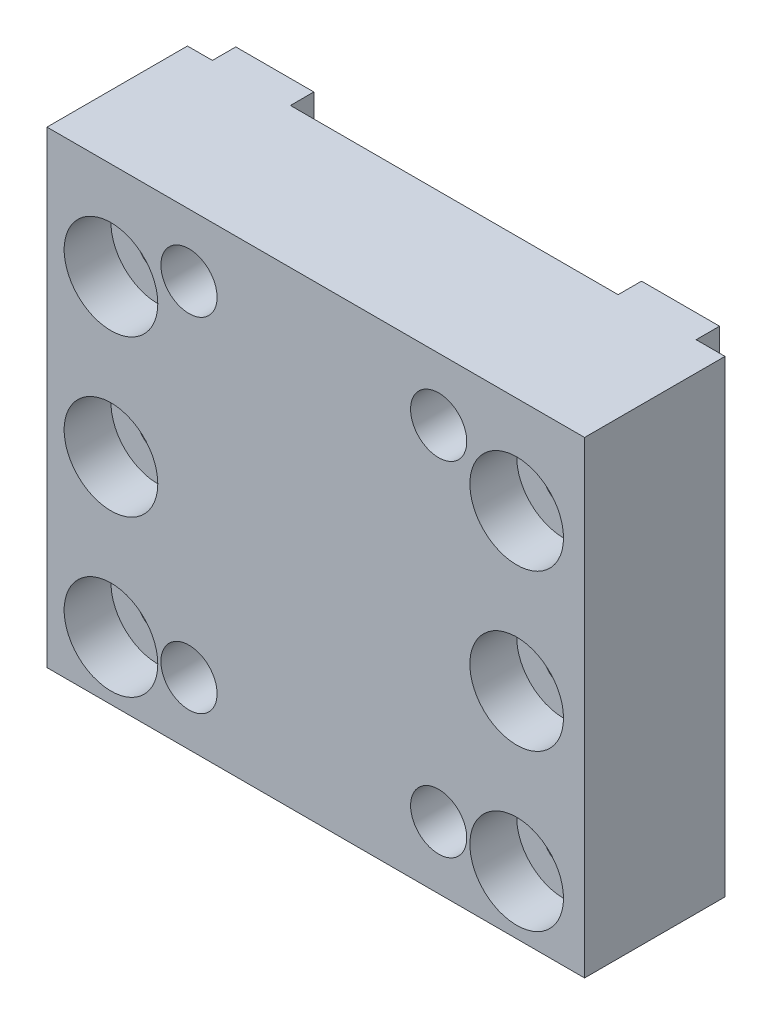
ISO-10303-21;
HEADER;
FILE_DESCRIPTION(('STEP AP214'),'2;1');
FILE_NAME('part.step','',(''),(''),'','','');
FILE_SCHEMA(('AUTOMOTIVE_DESIGN { 1 0 10303 214 1 1 1 1 }'));
ENDSEC;
DATA;
#1=APPLICATION_CONTEXT('core data for automotive mechanical design processes');
#2=APPLICATION_PROTOCOL_DEFINITION('international standard','automotive_design',2000,#1);
#3=PRODUCT_CONTEXT('',#1,'mechanical');
#4=PRODUCT('Part','Part','',(#3));
#5=PRODUCT_RELATED_PRODUCT_CATEGORY('part','',(#4));
#6=PRODUCT_DEFINITION_FORMATION('','',#4);
#7=PRODUCT_DEFINITION_CONTEXT('part definition',#1,'design');
#8=PRODUCT_DEFINITION('design','',#6,#7);
#9=PRODUCT_DEFINITION_SHAPE('','',#8);
#10=(LENGTH_UNIT() NAMED_UNIT(*) SI_UNIT(.MILLI.,.METRE.));
#11=(NAMED_UNIT(*) PLANE_ANGLE_UNIT() SI_UNIT($,.RADIAN.));
#12=(NAMED_UNIT(*) SI_UNIT($,.STERADIAN.) SOLID_ANGLE_UNIT());
#13=UNCERTAINTY_MEASURE_WITH_UNIT(LENGTH_MEASURE(1.E-05),#10,'distance_accuracy_value','');
#14=(GEOMETRIC_REPRESENTATION_CONTEXT(3) GLOBAL_UNCERTAINTY_ASSIGNED_CONTEXT((#13)) GLOBAL_UNIT_ASSIGNED_CONTEXT((#10,
#11,#12)) REPRESENTATION_CONTEXT('',''));
#15=CARTESIAN_POINT('',(0.,0.,0.));
#16=DIRECTION('',(0.,0.,1.));
#17=DIRECTION('',(1.,0.,0.));
#18=AXIS2_PLACEMENT_3D('',#15,#16,#17);
#19=CARTESIAN_POINT('',(0.,0.,9.));
#20=DIRECTION('',(0.,1.,0.));
#21=DIRECTION('',(0.,0.,1.));
#22=AXIS2_PLACEMENT_3D('',#19,#20,#21);
#23=PLANE('',#22);
#24=DIRECTION('',(1.,0.,0.));
#25=VECTOR('',#24,1.);
#26=CARTESIAN_POINT('',(0.,0.,0.));
#27=LINE('',#26,#25);
#28=CARTESIAN_POINT('',(50.6,0.,0.));
#29=VERTEX_POINT('',#28);
#30=CARTESIAN_POINT('',(52.45,0.,0.));
#31=VERTEX_POINT('',#30);
#32=EDGE_CURVE('E164',#29,#31,#27,.T.);
#33=ORIENTED_EDGE('',*,*,#32,.T.);
#34=DIRECTION('',(0.,0.,1.));
#35=VECTOR('',#34,1.);
#36=CARTESIAN_POINT('',(52.45,0.,-1.));
#37=LINE('',#36,#35);
#38=CARTESIAN_POINT('',(52.45,0.,9.));
#39=VERTEX_POINT('',#38);
#40=EDGE_CURVE('E68',#31,#39,#37,.T.);
#41=ORIENTED_EDGE('',*,*,#40,.T.);
#42=DIRECTION('',(1.,0.,0.));
#43=VECTOR('',#42,1.);
#44=CARTESIAN_POINT('',(0.,0.,9.));
#45=LINE('',#44,#43);
#46=CARTESIAN_POINT('',(18.,0.,9.));
#47=VERTEX_POINT('',#46);
#48=EDGE_CURVE('E146',#47,#39,#45,.T.);
#49=ORIENTED_EDGE('',*,*,#48,.F.);
#50=DIRECTION('',(0.,0.,1.));
#51=VECTOR('',#50,1.);
#52=CARTESIAN_POINT('',(18.,0.,-1.));
#53=LINE('',#52,#51);
#54=CARTESIAN_POINT('',(18.,0.,0.));
#55=VERTEX_POINT('',#54);
#56=EDGE_CURVE('E61',#55,#47,#53,.T.);
#57=ORIENTED_EDGE('',*,*,#56,.F.);
#58=CARTESIAN_POINT('',(19.6,0.,0.));
#59=VERTEX_POINT('',#58);
#60=EDGE_CURVE('E160',#55,#59,#27,.T.);
#61=ORIENTED_EDGE('',*,*,#60,.T.);
#62=DIRECTION('',(0.,0.,1.));
#63=VECTOR('',#62,1.);
#64=CARTESIAN_POINT('',(19.6,0.,-2.));
#65=LINE('',#64,#63);
#66=CARTESIAN_POINT('',(19.6,0.,-1.5));
#67=VERTEX_POINT('',#66);
#68=EDGE_CURVE('E207',#67,#59,#65,.T.);
#69=ORIENTED_EDGE('',*,*,#68,.F.);
#70=DIRECTION('',(1.,0.,0.));
#71=VECTOR('',#70,1.);
#72=CARTESIAN_POINT('',(19.6,0.,-1.5));
#73=LINE('',#72,#71);
#74=CARTESIAN_POINT('',(24.6,0.,-1.5));
#75=VERTEX_POINT('',#74);
#76=EDGE_CURVE('E54',#67,#75,#73,.T.);
#77=ORIENTED_EDGE('',*,*,#76,.T.);
#78=DIRECTION('',(0.,0.,1.));
#79=VECTOR('',#78,1.);
#80=CARTESIAN_POINT('',(24.6,0.,-2.));
#81=LINE('',#80,#79);
#82=CARTESIAN_POINT('',(24.6,0.,0.));
#83=VERTEX_POINT('',#82);
#84=EDGE_CURVE('E197',#75,#83,#81,.T.);
#85=ORIENTED_EDGE('',*,*,#84,.T.);
#86=CARTESIAN_POINT('',(45.6,0.,0.));
#87=VERTEX_POINT('',#86);
#88=EDGE_CURVE('E163',#83,#87,#27,.T.);
#89=ORIENTED_EDGE('',*,*,#88,.T.);
#90=DIRECTION('',(0.,0.,1.));
#91=VECTOR('',#90,1.);
#92=CARTESIAN_POINT('',(45.6,0.,-2.));
#93=LINE('',#92,#91);
#94=CARTESIAN_POINT('',(45.6,0.,-1.5));
#95=VERTEX_POINT('',#94);
#96=EDGE_CURVE('E191',#95,#87,#93,.T.);
#97=ORIENTED_EDGE('',*,*,#96,.F.);
#98=DIRECTION('',(1.,0.,0.));
#99=VECTOR('',#98,1.);
#100=CARTESIAN_POINT('',(45.6,0.,-1.5));
#101=LINE('',#100,#99);
#102=CARTESIAN_POINT('',(50.6,0.,-1.5));
#103=VERTEX_POINT('',#102);
#104=EDGE_CURVE('E152',#95,#103,#101,.T.);
#105=ORIENTED_EDGE('',*,*,#104,.T.);
#106=DIRECTION('',(0.,0.,1.));
#107=VECTOR('',#106,1.);
#108=CARTESIAN_POINT('',(50.6,0.,-2.));
#109=LINE('',#108,#107);
#110=EDGE_CURVE('E188',#103,#29,#109,.T.);
#111=ORIENTED_EDGE('',*,*,#110,.T.);
#112=EDGE_LOOP('',(#33,#41,#49,#57,#61,#69,#77,#85,#89,#97,#105,#111));
#113=FACE_BOUND('',#112,.T.);
#114=ADVANCED_FACE('F47',(#113),#23,.F.);
#115=CARTESIAN_POINT('',(0.,30.,9.));
#116=DIRECTION('',(0.,-1.,0.));
#117=DIRECTION('',(0.,0.,-1.));
#118=AXIS2_PLACEMENT_3D('',#115,#116,#117);
#119=PLANE('',#118);
#120=DIRECTION('',(-1.,0.,0.));
#121=VECTOR('',#120,1.);
#122=CARTESIAN_POINT('',(0.,30.,9.));
#123=LINE('',#122,#121);
#124=CARTESIAN_POINT('',(52.45,30.,9.));
#125=VERTEX_POINT('',#124);
#126=CARTESIAN_POINT('',(18.,30.,9.));
#127=VERTEX_POINT('',#126);
#128=EDGE_CURVE('E144',#125,#127,#123,.T.);
#129=ORIENTED_EDGE('',*,*,#128,.F.);
#130=DIRECTION('',(0.,0.,1.));
#131=VECTOR('',#130,1.);
#132=CARTESIAN_POINT('',(52.45,30.,-1.));
#133=LINE('',#132,#131);
#134=CARTESIAN_POINT('',(52.45,30.,0.));
#135=VERTEX_POINT('',#134);
#136=EDGE_CURVE('E132',#135,#125,#133,.T.);
#137=ORIENTED_EDGE('',*,*,#136,.F.);
#138=DIRECTION('',(-1.,0.,0.));
#139=VECTOR('',#138,1.);
#140=CARTESIAN_POINT('',(0.,30.,0.));
#141=LINE('',#140,#139);
#142=CARTESIAN_POINT('',(50.6,30.,0.));
#143=VERTEX_POINT('',#142);
#144=EDGE_CURVE('E156',#135,#143,#141,.T.);
#145=ORIENTED_EDGE('',*,*,#144,.T.);
#146=DIRECTION('',(0.,0.,1.));
#147=VECTOR('',#146,1.);
#148=CARTESIAN_POINT('',(50.6,30.,-2.));
#149=LINE('',#148,#147);
#150=CARTESIAN_POINT('',(50.6,30.,-1.5));
#151=VERTEX_POINT('',#150);
#152=EDGE_CURVE('E201',#151,#143,#149,.T.);
#153=ORIENTED_EDGE('',*,*,#152,.F.);
#154=DIRECTION('',(-1.,0.,0.));
#155=VECTOR('',#154,1.);
#156=CARTESIAN_POINT('',(45.6,30.,-1.5));
#157=LINE('',#156,#155);
#158=CARTESIAN_POINT('',(45.6,30.,-1.5));
#159=VERTEX_POINT('',#158);
#160=EDGE_CURVE('E154',#151,#159,#157,.T.);
#161=ORIENTED_EDGE('',*,*,#160,.T.);
#162=DIRECTION('',(0.,0.,1.));
#163=VECTOR('',#162,1.);
#164=CARTESIAN_POINT('',(45.6,30.,-2.));
#165=LINE('',#164,#163);
#166=CARTESIAN_POINT('',(45.6,30.,0.));
#167=VERTEX_POINT('',#166);
#168=EDGE_CURVE('E205',#159,#167,#165,.T.);
#169=ORIENTED_EDGE('',*,*,#168,.T.);
#170=CARTESIAN_POINT('',(24.6,30.,0.));
#171=VERTEX_POINT('',#170);
#172=EDGE_CURVE('E165',#167,#171,#141,.T.);
#173=ORIENTED_EDGE('',*,*,#172,.T.);
#174=DIRECTION('',(0.,0.,1.));
#175=VECTOR('',#174,1.);
#176=CARTESIAN_POINT('',(24.6,30.,-2.));
#177=LINE('',#176,#175);
#178=CARTESIAN_POINT('',(24.6,30.,-1.5));
#179=VERTEX_POINT('',#178);
#180=EDGE_CURVE('E211',#179,#171,#177,.T.);
#181=ORIENTED_EDGE('',*,*,#180,.F.);
#182=DIRECTION('',(-1.,0.,0.));
#183=VECTOR('',#182,1.);
#184=CARTESIAN_POINT('',(19.6,30.,-1.5));
#185=LINE('',#184,#183);
#186=CARTESIAN_POINT('',(19.6,30.,-1.5));
#187=VERTEX_POINT('',#186);
#188=EDGE_CURVE('E168',#179,#187,#185,.T.);
#189=ORIENTED_EDGE('',*,*,#188,.T.);
#190=DIRECTION('',(0.,0.,1.));
#191=VECTOR('',#190,1.);
#192=CARTESIAN_POINT('',(19.6,30.,-2.));
#193=LINE('',#192,#191);
#194=CARTESIAN_POINT('',(19.6,30.,0.));
#195=VERTEX_POINT('',#194);
#196=EDGE_CURVE('E204',#187,#195,#193,.T.);
#197=ORIENTED_EDGE('',*,*,#196,.T.);
#198=CARTESIAN_POINT('',(18.,30.,0.));
#199=VERTEX_POINT('',#198);
#200=EDGE_CURVE('E162',#195,#199,#141,.T.);
#201=ORIENTED_EDGE('',*,*,#200,.T.);
#202=DIRECTION('',(0.,0.,1.));
#203=VECTOR('',#202,1.);
#204=CARTESIAN_POINT('',(18.,30.,-1.));
#205=LINE('',#204,#203);
#206=EDGE_CURVE('E147',#199,#127,#205,.T.);
#207=ORIENTED_EDGE('',*,*,#206,.T.);
#208=EDGE_LOOP('',(#129,#137,#145,#153,#161,#169,#173,#181,#189,#197,#201,#207));
#209=FACE_BOUND('',#208,.T.);
#210=ADVANCED_FACE('F150',(#209),#119,.F.);
#211=CARTESIAN_POINT('',(48.1,23.75,9.));
#212=DIRECTION('',(0.,0.,-1.));
#213=DIRECTION('',(-1.,0.,0.));
#214=AXIS2_PLACEMENT_3D('',#211,#212,#213);
#215=CYLINDRICAL_SURFACE('',#214,1.3);
#216=CARTESIAN_POINT('',(48.1,23.75,-1.5));
#217=DIRECTION('',(0.,0.,-1.));
#218=DIRECTION('',(-1.,0.,0.));
#219=AXIS2_PLACEMENT_3D('',#216,#217,#218);
#220=CIRCLE('',#219,1.3);
#221=CARTESIAN_POINT('',(46.8,23.75,-1.5));
#222=VERTEX_POINT('',#221);
#223=EDGE_CURVE('E221',#222,#222,#220,.T.);
#224=ORIENTED_EDGE('',*,*,#223,.T.);
#225=EDGE_LOOP('',(#224));
#226=FACE_BOUND('',#225,.T.);
#227=CARTESIAN_POINT('',(48.1,23.75,6.));
#228=DIRECTION('',(0.,0.,1.));
#229=DIRECTION('',(1.,0.,0.));
#230=AXIS2_PLACEMENT_3D('',#227,#228,#229);
#231=CIRCLE('',#230,1.3);
#232=CARTESIAN_POINT('',(49.4,23.75,6.));
#233=VERTEX_POINT('',#232);
#234=EDGE_CURVE('E186',#233,#233,#231,.F.);
#235=ORIENTED_EDGE('',*,*,#234,.F.);
#236=EDGE_LOOP('',(#235));
#237=FACE_BOUND('',#236,.T.);
#238=ADVANCED_FACE('F372',(#226,#237),#215,.F.);
#239=CARTESIAN_POINT('',(22.1,3.75,9.));
#240=DIRECTION('',(0.,0.,-1.));
#241=DIRECTION('',(-1.,0.,0.));
#242=AXIS2_PLACEMENT_3D('',#239,#240,#241);
#243=CYLINDRICAL_SURFACE('',#242,1.3);
#244=CARTESIAN_POINT('',(22.1,3.74999999999999,-1.5));
#245=DIRECTION('',(0.,0.,-1.));
#246=DIRECTION('',(-1.,0.,0.));
#247=AXIS2_PLACEMENT_3D('',#244,#245,#246);
#248=CIRCLE('',#247,1.3);
#249=CARTESIAN_POINT('',(20.8,3.74999999999999,-1.5));
#250=VERTEX_POINT('',#249);
#251=EDGE_CURVE('E213',#250,#250,#248,.T.);
#252=ORIENTED_EDGE('',*,*,#251,.T.);
#253=EDGE_LOOP('',(#252));
#254=FACE_BOUND('',#253,.T.);
#255=CARTESIAN_POINT('',(22.1,3.75,6.));
#256=DIRECTION('',(0.,0.,1.));
#257=DIRECTION('',(1.,0.,0.));
#258=AXIS2_PLACEMENT_3D('',#255,#256,#257);
#259=CIRCLE('',#258,1.3);
#260=CARTESIAN_POINT('',(23.4,3.75,6.));
#261=VERTEX_POINT('',#260);
#262=EDGE_CURVE('E184',#261,#261,#259,.F.);
#263=ORIENTED_EDGE('',*,*,#262,.F.);
#264=EDGE_LOOP('',(#263));
#265=FACE_BOUND('',#264,.T.);
#266=ADVANCED_FACE('F376',(#254,#265),#243,.F.);
#267=CARTESIAN_POINT('',(22.1,13.75,9.));
#268=DIRECTION('',(0.,0.,-1.));
#269=DIRECTION('',(-1.,0.,0.));
#270=AXIS2_PLACEMENT_3D('',#267,#268,#269);
#271=CYLINDRICAL_SURFACE('',#270,1.3);
#272=CARTESIAN_POINT('',(22.1,13.75,-1.5));
#273=DIRECTION('',(0.,0.,-1.));
#274=DIRECTION('',(-1.,0.,0.));
#275=AXIS2_PLACEMENT_3D('',#272,#273,#274);
#276=CIRCLE('',#275,1.3);
#277=CARTESIAN_POINT('',(20.8,13.75,-1.5));
#278=VERTEX_POINT('',#277);
#279=EDGE_CURVE('E217',#278,#278,#276,.T.);
#280=ORIENTED_EDGE('',*,*,#279,.T.);
#281=EDGE_LOOP('',(#280));
#282=FACE_BOUND('',#281,.T.);
#283=CARTESIAN_POINT('',(22.1,13.75,6.));
#284=DIRECTION('',(0.,0.,1.));
#285=DIRECTION('',(1.,0.,0.));
#286=AXIS2_PLACEMENT_3D('',#283,#284,#285);
#287=CIRCLE('',#286,1.3);
#288=CARTESIAN_POINT('',(23.4,13.75,6.));
#289=VERTEX_POINT('',#288);
#290=EDGE_CURVE('E181',#289,#289,#287,.F.);
#291=ORIENTED_EDGE('',*,*,#290,.F.);
#292=EDGE_LOOP('',(#291));
#293=FACE_BOUND('',#292,.T.);
#294=ADVANCED_FACE('F382',(#282,#293),#271,.F.);
#295=CARTESIAN_POINT('',(22.1,23.75,9.));
#296=DIRECTION('',(0.,0.,-1.));
#297=DIRECTION('',(-1.,0.,0.));
#298=AXIS2_PLACEMENT_3D('',#295,#296,#297);
#299=CYLINDRICAL_SURFACE('',#298,1.3);
#300=CARTESIAN_POINT('',(22.1,23.75,-1.5));
#301=DIRECTION('',(0.,0.,-1.));
#302=DIRECTION('',(-1.,0.,0.));
#303=AXIS2_PLACEMENT_3D('',#300,#301,#302);
#304=CIRCLE('',#303,1.3);
#305=CARTESIAN_POINT('',(20.8,23.75,-1.5));
#306=VERTEX_POINT('',#305);
#307=EDGE_CURVE('E225',#306,#306,#304,.T.);
#308=ORIENTED_EDGE('',*,*,#307,.T.);
#309=EDGE_LOOP('',(#308));
#310=FACE_BOUND('',#309,.T.);
#311=CARTESIAN_POINT('',(22.1,23.75,6.));
#312=DIRECTION('',(0.,0.,1.));
#313=DIRECTION('',(1.,0.,0.));
#314=AXIS2_PLACEMENT_3D('',#311,#312,#313);
#315=CIRCLE('',#314,1.3);
#316=CARTESIAN_POINT('',(23.4,23.75,6.));
#317=VERTEX_POINT('',#316);
#318=EDGE_CURVE('E178',#317,#317,#315,.F.);
#319=ORIENTED_EDGE('',*,*,#318,.F.);
#320=EDGE_LOOP('',(#319));
#321=FACE_BOUND('',#320,.T.);
#322=ADVANCED_FACE('F683',(#310,#321),#299,.F.);
#323=CARTESIAN_POINT('',(48.1,3.75,9.));
#324=DIRECTION('',(0.,0.,-1.));
#325=DIRECTION('',(-1.,0.,0.));
#326=AXIS2_PLACEMENT_3D('',#323,#324,#325);
#327=CYLINDRICAL_SURFACE('',#326,1.3);
#328=CARTESIAN_POINT('',(48.1,3.74999999999999,-1.5));
#329=DIRECTION('',(0.,0.,-1.));
#330=DIRECTION('',(-1.,0.,0.));
#331=AXIS2_PLACEMENT_3D('',#328,#329,#330);
#332=CIRCLE('',#331,1.3);
#333=CARTESIAN_POINT('',(46.8,3.74999999999999,-1.5));
#334=VERTEX_POINT('',#333);
#335=EDGE_CURVE('E222',#334,#334,#332,.T.);
#336=ORIENTED_EDGE('',*,*,#335,.T.);
#337=EDGE_LOOP('',(#336));
#338=FACE_BOUND('',#337,.T.);
#339=CARTESIAN_POINT('',(48.1,3.75,6.));
#340=DIRECTION('',(0.,0.,1.));
#341=DIRECTION('',(1.,0.,0.));
#342=AXIS2_PLACEMENT_3D('',#339,#340,#341);
#343=CIRCLE('',#342,1.3);
#344=CARTESIAN_POINT('',(49.4,3.75,6.));
#345=VERTEX_POINT('',#344);
#346=EDGE_CURVE('E174',#345,#345,#343,.F.);
#347=ORIENTED_EDGE('',*,*,#346,.F.);
#348=EDGE_LOOP('',(#347));
#349=FACE_BOUND('',#348,.T.);
#350=ADVANCED_FACE('F693',(#338,#349),#327,.F.);
#351=CARTESIAN_POINT('',(48.1,13.75,9.));
#352=DIRECTION('',(0.,0.,-1.));
#353=DIRECTION('',(-1.,0.,0.));
#354=AXIS2_PLACEMENT_3D('',#351,#352,#353);
#355=CYLINDRICAL_SURFACE('',#354,1.3);
#356=CARTESIAN_POINT('',(48.1,13.75,-1.5));
#357=DIRECTION('',(0.,0.,-1.));
#358=DIRECTION('',(-1.,0.,0.));
#359=AXIS2_PLACEMENT_3D('',#356,#357,#358);
#360=CIRCLE('',#359,1.3);
#361=CARTESIAN_POINT('',(46.8,13.75,-1.5));
#362=VERTEX_POINT('',#361);
#363=EDGE_CURVE('E218',#362,#362,#360,.T.);
#364=ORIENTED_EDGE('',*,*,#363,.T.);
#365=EDGE_LOOP('',(#364));
#366=FACE_BOUND('',#365,.T.);
#367=CARTESIAN_POINT('',(48.1,13.75,6.));
#368=DIRECTION('',(0.,0.,1.));
#369=DIRECTION('',(1.,0.,0.));
#370=AXIS2_PLACEMENT_3D('',#367,#368,#369);
#371=CIRCLE('',#370,1.3);
#372=CARTESIAN_POINT('',(49.4,13.75,6.));
#373=VERTEX_POINT('',#372);
#374=EDGE_CURVE('E171',#373,#373,#371,.F.);
#375=ORIENTED_EDGE('',*,*,#374,.F.);
#376=EDGE_LOOP('',(#375));
#377=FACE_BOUND('',#376,.T.);
#378=ADVANCED_FACE('F702',(#366,#377),#355,.F.);
#379=CARTESIAN_POINT('',(0.,0.,0.));
#380=DIRECTION('',(0.,0.,-1.));
#381=DIRECTION('',(-1.,0.,0.));
#382=AXIS2_PLACEMENT_3D('',#379,#380,#381);
#383=PLANE('',#382);
#384=CARTESIAN_POINT('',(27.1,4.,0.));
#385=DIRECTION('',(0.,0.,-1.));
#386=DIRECTION('',(-1.,0.,0.));
#387=AXIS2_PLACEMENT_3D('',#384,#385,#386);
#388=CIRCLE('',#387,1.8);
#389=CARTESIAN_POINT('',(25.3,4.,0.));
#390=VERTEX_POINT('',#389);
#391=EDGE_CURVE('E290',#390,#390,#388,.T.);
#392=ORIENTED_EDGE('',*,*,#391,.F.);
#393=EDGE_LOOP('',(#392));
#394=FACE_BOUND('',#393,.T.);
#395=CARTESIAN_POINT('',(27.1,26.,0.));
#396=DIRECTION('',(0.,0.,-1.));
#397=DIRECTION('',(-1.,0.,0.));
#398=AXIS2_PLACEMENT_3D('',#395,#396,#397);
#399=CIRCLE('',#398,1.8);
#400=CARTESIAN_POINT('',(25.3,26.,0.));
#401=VERTEX_POINT('',#400);
#402=EDGE_CURVE('E305',#401,#401,#399,.T.);
#403=ORIENTED_EDGE('',*,*,#402,.F.);
#404=EDGE_LOOP('',(#403));
#405=FACE_BOUND('',#404,.T.);
#406=CARTESIAN_POINT('',(43.1,26.,0.));
#407=DIRECTION('',(0.,0.,-1.));
#408=DIRECTION('',(-1.,0.,0.));
#409=AXIS2_PLACEMENT_3D('',#406,#407,#408);
#410=CIRCLE('',#409,1.8);
#411=CARTESIAN_POINT('',(41.3,26.,0.));
#412=VERTEX_POINT('',#411);
#413=EDGE_CURVE('E297',#412,#412,#410,.T.);
#414=ORIENTED_EDGE('',*,*,#413,.F.);
#415=EDGE_LOOP('',(#414));
#416=FACE_BOUND('',#415,.T.);
#417=CARTESIAN_POINT('',(43.1,4.,0.));
#418=DIRECTION('',(0.,0.,-1.));
#419=DIRECTION('',(-1.,0.,0.));
#420=AXIS2_PLACEMENT_3D('',#417,#418,#419);
#421=CIRCLE('',#420,1.8);
#422=CARTESIAN_POINT('',(41.3,4.,0.));
#423=VERTEX_POINT('',#422);
#424=EDGE_CURVE('E304',#423,#423,#421,.T.);
#425=ORIENTED_EDGE('',*,*,#424,.F.);
#426=EDGE_LOOP('',(#425));
#427=FACE_BOUND('',#426,.T.);
#428=DIRECTION('',(0.,1.,0.));
#429=VECTOR('',#428,1.);
#430=CARTESIAN_POINT('',(45.6,-6.25000000000001,0.));
#431=LINE('',#430,#429);
#432=EDGE_CURVE('E232',#87,#167,#431,.T.);
#433=ORIENTED_EDGE('',*,*,#432,.F.);
#434=ORIENTED_EDGE('',*,*,#88,.F.);
#435=DIRECTION('',(0.,1.,0.));
#436=VECTOR('',#435,1.);
#437=CARTESIAN_POINT('',(24.6,-6.25000000000001,0.));
#438=LINE('',#437,#436);
#439=EDGE_CURVE('E251',#83,#171,#438,.T.);
#440=ORIENTED_EDGE('',*,*,#439,.T.);
#441=ORIENTED_EDGE('',*,*,#172,.F.);
#442=EDGE_LOOP('',(#433,#434,#440,#441));
#443=FACE_BOUND('',#442,.T.);
#444=ADVANCED_FACE('F271',(#394,#405,#416,#427,#443),#383,.T.);
#445=DIRECTION('',(0.,-1.,0.));
#446=VECTOR('',#445,1.);
#447=CARTESIAN_POINT('',(18.,0.,0.));
#448=LINE('',#447,#446);
#449=EDGE_CURVE('E264',#199,#55,#448,.T.);
#450=ORIENTED_EDGE('',*,*,#449,.F.);
#451=ORIENTED_EDGE('',*,*,#200,.F.);
#452=DIRECTION('',(0.,1.,0.));
#453=VECTOR('',#452,1.);
#454=CARTESIAN_POINT('',(19.6,-6.25000000000001,0.));
#455=LINE('',#454,#453);
#456=EDGE_CURVE('E236',#59,#195,#455,.T.);
#457=ORIENTED_EDGE('',*,*,#456,.F.);
#458=ORIENTED_EDGE('',*,*,#60,.F.);
#459=EDGE_LOOP('',(#450,#451,#457,#458));
#460=FACE_BOUND('',#459,.T.);
#461=ADVANCED_FACE('F263',(#460),#383,.T.);
#462=CARTESIAN_POINT('',(0.,0.,9.));
#463=DIRECTION('',(0.,0.,-1.));
#464=DIRECTION('',(-1.,0.,0.));
#465=AXIS2_PLACEMENT_3D('',#462,#463,#464);
#466=PLANE('',#465);
#467=CARTESIAN_POINT('',(27.1,4.,9.));
#468=DIRECTION('',(0.,0.,-1.));
#469=DIRECTION('',(-1.,0.,0.));
#470=AXIS2_PLACEMENT_3D('',#467,#468,#469);
#471=CIRCLE('',#470,1.8);
#472=CARTESIAN_POINT('',(25.3,4.,9.));
#473=VERTEX_POINT('',#472);
#474=EDGE_CURVE('E308',#473,#473,#471,.F.);
#475=ORIENTED_EDGE('',*,*,#474,.F.);
#476=EDGE_LOOP('',(#475));
#477=FACE_BOUND('',#476,.T.);
#478=CARTESIAN_POINT('',(27.1,26.,9.));
#479=DIRECTION('',(0.,0.,-1.));
#480=DIRECTION('',(-1.,0.,0.));
#481=AXIS2_PLACEMENT_3D('',#478,#479,#480);
#482=CIRCLE('',#481,1.8);
#483=CARTESIAN_POINT('',(25.3,26.,9.));
#484=VERTEX_POINT('',#483);
#485=EDGE_CURVE('E301',#484,#484,#482,.F.);
#486=ORIENTED_EDGE('',*,*,#485,.F.);
#487=EDGE_LOOP('',(#486));
#488=FACE_BOUND('',#487,.T.);
#489=CARTESIAN_POINT('',(43.1,26.,9.));
#490=DIRECTION('',(0.,0.,-1.));
#491=DIRECTION('',(-1.,0.,0.));
#492=AXIS2_PLACEMENT_3D('',#489,#490,#491);
#493=CIRCLE('',#492,1.8);
#494=CARTESIAN_POINT('',(41.3,26.,9.));
#495=VERTEX_POINT('',#494);
#496=EDGE_CURVE('E300',#495,#495,#493,.F.);
#497=ORIENTED_EDGE('',*,*,#496,.F.);
#498=EDGE_LOOP('',(#497));
#499=FACE_BOUND('',#498,.T.);
#500=CARTESIAN_POINT('',(43.1,4.,9.));
#501=DIRECTION('',(0.,0.,-1.));
#502=DIRECTION('',(-1.,0.,0.));
#503=AXIS2_PLACEMENT_3D('',#500,#501,#502);
#504=CIRCLE('',#503,1.8);
#505=CARTESIAN_POINT('',(41.3,4.,9.));
#506=VERTEX_POINT('',#505);
#507=EDGE_CURVE('E317',#506,#506,#504,.F.);
#508=ORIENTED_EDGE('',*,*,#507,.F.);
#509=EDGE_LOOP('',(#508));
#510=FACE_BOUND('',#509,.T.);
#511=CARTESIAN_POINT('',(48.1,23.75,9.));
#512=DIRECTION('',(0.,0.,1.));
#513=DIRECTION('',(1.,0.,0.));
#514=AXIS2_PLACEMENT_3D('',#511,#512,#513);
#515=CIRCLE('',#514,3.);
#516=CARTESIAN_POINT('',(51.1,23.75,9.));
#517=VERTEX_POINT('',#516);
#518=EDGE_CURVE('E320',#517,#517,#515,.T.);
#519=ORIENTED_EDGE('',*,*,#518,.F.);
#520=EDGE_LOOP('',(#519));
#521=FACE_BOUND('',#520,.T.);
#522=CARTESIAN_POINT('',(48.1,3.75,9.));
#523=DIRECTION('',(0.,0.,1.));
#524=DIRECTION('',(1.,0.,0.));
#525=AXIS2_PLACEMENT_3D('',#522,#523,#524);
#526=CIRCLE('',#525,3.);
#527=CARTESIAN_POINT('',(51.1,3.75,9.));
#528=VERTEX_POINT('',#527);
#529=EDGE_CURVE('E343',#528,#528,#526,.T.);
#530=ORIENTED_EDGE('',*,*,#529,.F.);
#531=EDGE_LOOP('',(#530));
#532=FACE_BOUND('',#531,.T.);
#533=CARTESIAN_POINT('',(48.1,13.75,9.));
#534=DIRECTION('',(0.,0.,1.));
#535=DIRECTION('',(1.,0.,0.));
#536=AXIS2_PLACEMENT_3D('',#533,#534,#535);
#537=CIRCLE('',#536,3.);
#538=CARTESIAN_POINT('',(51.1,13.75,9.));
#539=VERTEX_POINT('',#538);
#540=EDGE_CURVE('E337',#539,#539,#537,.T.);
#541=ORIENTED_EDGE('',*,*,#540,.F.);
#542=EDGE_LOOP('',(#541));
#543=FACE_BOUND('',#542,.T.);
#544=CARTESIAN_POINT('',(22.1,3.75,9.));
#545=DIRECTION('',(0.,0.,1.));
#546=DIRECTION('',(1.,0.,0.));
#547=AXIS2_PLACEMENT_3D('',#544,#545,#546);
#548=CIRCLE('',#547,3.);
#549=CARTESIAN_POINT('',(25.1,3.75,9.));
#550=VERTEX_POINT('',#549);
#551=EDGE_CURVE('E331',#550,#550,#548,.T.);
#552=ORIENTED_EDGE('',*,*,#551,.F.);
#553=EDGE_LOOP('',(#552));
#554=FACE_BOUND('',#553,.T.);
#555=CARTESIAN_POINT('',(22.1,13.75,9.));
#556=DIRECTION('',(0.,0.,1.));
#557=DIRECTION('',(1.,0.,0.));
#558=AXIS2_PLACEMENT_3D('',#555,#556,#557);
#559=CIRCLE('',#558,3.);
#560=CARTESIAN_POINT('',(25.1,13.75,9.));
#561=VERTEX_POINT('',#560);
#562=EDGE_CURVE('E325',#561,#561,#559,.T.);
#563=ORIENTED_EDGE('',*,*,#562,.F.);
#564=EDGE_LOOP('',(#563));
#565=FACE_BOUND('',#564,.T.);
#566=CARTESIAN_POINT('',(22.1,23.75,9.));
#567=DIRECTION('',(0.,0.,1.));
#568=DIRECTION('',(1.,0.,0.));
#569=AXIS2_PLACEMENT_3D('',#566,#567,#568);
#570=CIRCLE('',#569,3.);
#571=CARTESIAN_POINT('',(25.1,23.75,9.));
#572=VERTEX_POINT('',#571);
#573=EDGE_CURVE('E324',#572,#572,#570,.T.);
#574=ORIENTED_EDGE('',*,*,#573,.F.);
#575=EDGE_LOOP('',(#574));
#576=FACE_BOUND('',#575,.T.);
#577=ORIENTED_EDGE('',*,*,#48,.T.);
#578=DIRECTION('',(0.,-1.,0.));
#579=VECTOR('',#578,1.);
#580=CARTESIAN_POINT('',(52.45,30.,9.));
#581=LINE('',#580,#579);
#582=EDGE_CURVE('E135',#125,#39,#581,.T.);
#583=ORIENTED_EDGE('',*,*,#582,.F.);
#584=ORIENTED_EDGE('',*,*,#128,.T.);
#585=DIRECTION('',(0.,1.,0.));
#586=VECTOR('',#585,1.);
#587=CARTESIAN_POINT('',(18.,30.,9.));
#588=LINE('',#587,#586);
#589=EDGE_CURVE('E293',#47,#127,#588,.T.);
#590=ORIENTED_EDGE('',*,*,#589,.F.);
#591=EDGE_LOOP('',(#577,#583,#584,#590));
#592=FACE_BOUND('',#591,.T.);
#593=ADVANCED_FACE('F143',(#477,#488,#499,#510,#521,#532,#543,#554,#565,#576,#592),#466,.F.);
#594=DIRECTION('',(0.,1.,0.));
#595=VECTOR('',#594,1.);
#596=CARTESIAN_POINT('',(52.45,0.,0.));
#597=LINE('',#596,#595);
#598=EDGE_CURVE('E13',#31,#135,#597,.T.);
#599=ORIENTED_EDGE('',*,*,#598,.F.);
#600=ORIENTED_EDGE('',*,*,#32,.F.);
#601=DIRECTION('',(0.,1.,0.));
#602=VECTOR('',#601,1.);
#603=CARTESIAN_POINT('',(50.6,-6.25000000000001,0.));
#604=LINE('',#603,#602);
#605=EDGE_CURVE('E240',#29,#143,#604,.T.);
#606=ORIENTED_EDGE('',*,*,#605,.T.);
#607=ORIENTED_EDGE('',*,*,#144,.F.);
#608=EDGE_LOOP('',(#599,#600,#606,#607));
#609=FACE_BOUND('',#608,.T.);
#610=ADVANCED_FACE('F288',(#609),#383,.T.);
#611=CARTESIAN_POINT('',(50.6,-6.25,9.));
#612=DIRECTION('',(1.,0.,0.));
#613=DIRECTION('',(0.,0.,-1.));
#614=AXIS2_PLACEMENT_3D('',#611,#612,#613);
#615=PLANE('',#614);
#616=ORIENTED_EDGE('',*,*,#152,.T.);
#617=ORIENTED_EDGE('',*,*,#605,.F.);
#618=ORIENTED_EDGE('',*,*,#110,.F.);
#619=DIRECTION('',(0.,1.,0.));
#620=VECTOR('',#619,1.);
#621=CARTESIAN_POINT('',(50.6,-6.25000000000001,-1.5));
#622=LINE('',#621,#620);
#623=EDGE_CURVE('E237',#103,#151,#622,.T.);
#624=ORIENTED_EDGE('',*,*,#623,.T.);
#625=EDGE_LOOP('',(#616,#617,#618,#624));
#626=FACE_BOUND('',#625,.T.);
#627=ADVANCED_FACE('F285',(#626),#615,.T.);
#628=CARTESIAN_POINT('',(45.6,-6.25,0.));
#629=DIRECTION('',(-1.,0.,0.));
#630=DIRECTION('',(0.,0.,1.));
#631=AXIS2_PLACEMENT_3D('',#628,#629,#630);
#632=PLANE('',#631);
#633=ORIENTED_EDGE('',*,*,#168,.F.);
#634=DIRECTION('',(0.,1.,0.));
#635=VECTOR('',#634,1.);
#636=CARTESIAN_POINT('',(45.6,-6.25000000000001,-1.5));
#637=LINE('',#636,#635);
#638=EDGE_CURVE('E233',#95,#159,#637,.T.);
#639=ORIENTED_EDGE('',*,*,#638,.F.);
#640=ORIENTED_EDGE('',*,*,#96,.T.);
#641=ORIENTED_EDGE('',*,*,#432,.T.);
#642=EDGE_LOOP('',(#633,#639,#640,#641));
#643=FACE_BOUND('',#642,.T.);
#644=ADVANCED_FACE('F276',(#643),#632,.T.);
#645=CARTESIAN_POINT('',(24.6,-6.25,9.));
#646=DIRECTION('',(1.,0.,0.));
#647=DIRECTION('',(0.,0.,-1.));
#648=AXIS2_PLACEMENT_3D('',#645,#646,#647);
#649=PLANE('',#648);
#650=ORIENTED_EDGE('',*,*,#84,.F.);
#651=DIRECTION('',(0.,1.,0.));
#652=VECTOR('',#651,1.);
#653=CARTESIAN_POINT('',(24.6,-6.25000000000001,-1.5));
#654=LINE('',#653,#652);
#655=EDGE_CURVE('E248',#75,#179,#654,.T.);
#656=ORIENTED_EDGE('',*,*,#655,.T.);
#657=ORIENTED_EDGE('',*,*,#180,.T.);
#658=ORIENTED_EDGE('',*,*,#439,.F.);
#659=EDGE_LOOP('',(#650,#656,#657,#658));
#660=FACE_BOUND('',#659,.T.);
#661=ADVANCED_FACE('F392',(#660),#649,.T.);
#662=CARTESIAN_POINT('',(19.6,-6.25,0.));
#663=DIRECTION('',(-1.,0.,0.));
#664=DIRECTION('',(0.,0.,1.));
#665=AXIS2_PLACEMENT_3D('',#662,#663,#664);
#666=PLANE('',#665);
#667=ORIENTED_EDGE('',*,*,#68,.T.);
#668=ORIENTED_EDGE('',*,*,#456,.T.);
#669=ORIENTED_EDGE('',*,*,#196,.F.);
#670=DIRECTION('',(0.,1.,0.));
#671=VECTOR('',#670,1.);
#672=CARTESIAN_POINT('',(19.6,-6.25000000000001,-1.5));
#673=LINE('',#672,#671);
#674=EDGE_CURVE('E245',#67,#187,#673,.T.);
#675=ORIENTED_EDGE('',*,*,#674,.F.);
#676=EDGE_LOOP('',(#667,#668,#669,#675));
#677=FACE_BOUND('',#676,.T.);
#678=ADVANCED_FACE('F257',(#677),#666,.T.);
#679=CARTESIAN_POINT('',(19.6,-6.25000000000001,-1.5));
#680=DIRECTION('',(0.,0.,-1.));
#681=DIRECTION('',(-1.,0.,0.));
#682=AXIS2_PLACEMENT_3D('',#679,#680,#681);
#683=PLANE('',#682);
#684=ORIENTED_EDGE('',*,*,#76,.F.);
#685=ORIENTED_EDGE('',*,*,#674,.T.);
#686=ORIENTED_EDGE('',*,*,#188,.F.);
#687=ORIENTED_EDGE('',*,*,#655,.F.);
#688=EDGE_LOOP('',(#684,#685,#686,#687));
#689=FACE_BOUND('',#688,.T.);
#690=ORIENTED_EDGE('',*,*,#307,.F.);
#691=EDGE_LOOP('',(#690));
#692=FACE_BOUND('',#691,.T.);
#693=ORIENTED_EDGE('',*,*,#279,.F.);
#694=EDGE_LOOP('',(#693));
#695=FACE_BOUND('',#694,.T.);
#696=ORIENTED_EDGE('',*,*,#251,.F.);
#697=EDGE_LOOP('',(#696));
#698=FACE_BOUND('',#697,.T.);
#699=ADVANCED_FACE('F391',(#689,#692,#695,#698),#683,.T.);
#700=CARTESIAN_POINT('',(45.6,-6.25000000000001,-1.5));
#701=DIRECTION('',(0.,0.,-1.));
#702=DIRECTION('',(-1.,0.,0.));
#703=AXIS2_PLACEMENT_3D('',#700,#701,#702);
#704=PLANE('',#703);
#705=ORIENTED_EDGE('',*,*,#160,.F.);
#706=ORIENTED_EDGE('',*,*,#623,.F.);
#707=ORIENTED_EDGE('',*,*,#104,.F.);
#708=ORIENTED_EDGE('',*,*,#638,.T.);
#709=EDGE_LOOP('',(#705,#706,#707,#708));
#710=FACE_BOUND('',#709,.T.);
#711=ORIENTED_EDGE('',*,*,#363,.F.);
#712=EDGE_LOOP('',(#711));
#713=FACE_BOUND('',#712,.T.);
#714=ORIENTED_EDGE('',*,*,#335,.F.);
#715=EDGE_LOOP('',(#714));
#716=FACE_BOUND('',#715,.T.);
#717=ORIENTED_EDGE('',*,*,#223,.F.);
#718=EDGE_LOOP('',(#717));
#719=FACE_BOUND('',#718,.T.);
#720=ADVANCED_FACE('F282',(#710,#713,#716,#719),#704,.T.);
#721=CARTESIAN_POINT('',(48.1,13.75,6.));
#722=DIRECTION('',(0.,0.,1.));
#723=DIRECTION('',(1.,0.,0.));
#724=AXIS2_PLACEMENT_3D('',#721,#722,#723);
#725=PLANE('',#724);
#726=CARTESIAN_POINT('',(48.1,13.75,6.));
#727=DIRECTION('',(0.,0.,1.));
#728=DIRECTION('',(1.,0.,0.));
#729=AXIS2_PLACEMENT_3D('',#726,#727,#728);
#730=CIRCLE('',#729,3.);
#731=CARTESIAN_POINT('',(51.1,13.75,6.));
#732=VERTEX_POINT('',#731);
#733=EDGE_CURVE('E334',#732,#732,#730,.T.);
#734=ORIENTED_EDGE('',*,*,#733,.T.);
#735=EDGE_LOOP('',(#734));
#736=FACE_BOUND('',#735,.T.);
#737=ORIENTED_EDGE('',*,*,#374,.T.);
#738=EDGE_LOOP('',(#737));
#739=FACE_BOUND('',#738,.T.);
#740=ADVANCED_FACE('F427',(#736,#739),#725,.T.);
#741=CARTESIAN_POINT('',(48.1,13.75,6.));
#742=DIRECTION('',(0.,0.,1.));
#743=DIRECTION('',(1.,0.,0.));
#744=AXIS2_PLACEMENT_3D('',#741,#742,#743);
#745=CYLINDRICAL_SURFACE('',#744,3.);
#746=ORIENTED_EDGE('',*,*,#733,.F.);
#747=EDGE_LOOP('',(#746));
#748=FACE_BOUND('',#747,.T.);
#749=ORIENTED_EDGE('',*,*,#540,.T.);
#750=EDGE_LOOP('',(#749));
#751=FACE_BOUND('',#750,.T.);
#752=ADVANCED_FACE('F434',(#748,#751),#745,.F.);
#753=CARTESIAN_POINT('',(48.1,3.75,6.));
#754=DIRECTION('',(0.,0.,1.));
#755=DIRECTION('',(1.,0.,0.));
#756=AXIS2_PLACEMENT_3D('',#753,#754,#755);
#757=PLANE('',#756);
#758=CARTESIAN_POINT('',(48.1,3.75,6.));
#759=DIRECTION('',(0.,0.,1.));
#760=DIRECTION('',(1.,0.,0.));
#761=AXIS2_PLACEMENT_3D('',#758,#759,#760);
#762=CIRCLE('',#761,3.);
#763=CARTESIAN_POINT('',(51.1,3.75,6.));
#764=VERTEX_POINT('',#763);
#765=EDGE_CURVE('E340',#764,#764,#762,.T.);
#766=ORIENTED_EDGE('',*,*,#765,.T.);
#767=EDGE_LOOP('',(#766));
#768=FACE_BOUND('',#767,.T.);
#769=ORIENTED_EDGE('',*,*,#346,.T.);
#770=EDGE_LOOP('',(#769));
#771=FACE_BOUND('',#770,.T.);
#772=ADVANCED_FACE('F443',(#768,#771),#757,.T.);
#773=CARTESIAN_POINT('',(48.1,3.75,6.));
#774=DIRECTION('',(0.,0.,1.));
#775=DIRECTION('',(1.,0.,0.));
#776=AXIS2_PLACEMENT_3D('',#773,#774,#775);
#777=CYLINDRICAL_SURFACE('',#776,3.);
#778=ORIENTED_EDGE('',*,*,#765,.F.);
#779=EDGE_LOOP('',(#778));
#780=FACE_BOUND('',#779,.T.);
#781=ORIENTED_EDGE('',*,*,#529,.T.);
#782=EDGE_LOOP('',(#781));
#783=FACE_BOUND('',#782,.T.);
#784=ADVANCED_FACE('F451',(#780,#783),#777,.F.);
#785=CARTESIAN_POINT('',(22.1,23.75,6.));
#786=DIRECTION('',(0.,0.,1.));
#787=DIRECTION('',(1.,0.,0.));
#788=AXIS2_PLACEMENT_3D('',#785,#786,#787);
#789=PLANE('',#788);
#790=CARTESIAN_POINT('',(22.1,23.75,6.));
#791=DIRECTION('',(0.,0.,1.));
#792=DIRECTION('',(1.,0.,0.));
#793=AXIS2_PLACEMENT_3D('',#790,#791,#792);
#794=CIRCLE('',#793,3.);
#795=CARTESIAN_POINT('',(25.1,23.75,6.));
#796=VERTEX_POINT('',#795);
#797=EDGE_CURVE('E175',#796,#796,#794,.T.);
#798=ORIENTED_EDGE('',*,*,#797,.T.);
#799=EDGE_LOOP('',(#798));
#800=FACE_BOUND('',#799,.T.);
#801=ORIENTED_EDGE('',*,*,#318,.T.);
#802=EDGE_LOOP('',(#801));
#803=FACE_BOUND('',#802,.T.);
#804=ADVANCED_FACE('F459',(#800,#803),#789,.T.);
#805=CARTESIAN_POINT('',(22.1,23.75,6.));
#806=DIRECTION('',(0.,0.,1.));
#807=DIRECTION('',(1.,0.,0.));
#808=AXIS2_PLACEMENT_3D('',#805,#806,#807);
#809=CYLINDRICAL_SURFACE('',#808,3.);
#810=ORIENTED_EDGE('',*,*,#797,.F.);
#811=EDGE_LOOP('',(#810));
#812=FACE_BOUND('',#811,.T.);
#813=ORIENTED_EDGE('',*,*,#573,.T.);
#814=EDGE_LOOP('',(#813));
#815=FACE_BOUND('',#814,.T.);
#816=ADVANCED_FACE('F355',(#812,#815),#809,.F.);
#817=CARTESIAN_POINT('',(22.1,13.75,6.));
#818=DIRECTION('',(0.,0.,1.));
#819=DIRECTION('',(1.,0.,0.));
#820=AXIS2_PLACEMENT_3D('',#817,#818,#819);
#821=PLANE('',#820);
#822=CARTESIAN_POINT('',(22.1,13.75,6.));
#823=DIRECTION('',(0.,0.,1.));
#824=DIRECTION('',(1.,0.,0.));
#825=AXIS2_PLACEMENT_3D('',#822,#823,#824);
#826=CIRCLE('',#825,3.);
#827=CARTESIAN_POINT('',(25.1,13.75,6.));
#828=VERTEX_POINT('',#827);
#829=EDGE_CURVE('E321',#828,#828,#826,.T.);
#830=ORIENTED_EDGE('',*,*,#829,.T.);
#831=EDGE_LOOP('',(#830));
#832=FACE_BOUND('',#831,.T.);
#833=ORIENTED_EDGE('',*,*,#290,.T.);
#834=EDGE_LOOP('',(#833));
#835=FACE_BOUND('',#834,.T.);
#836=ADVANCED_FACE('F474',(#832,#835),#821,.T.);
#837=CARTESIAN_POINT('',(22.1,13.75,6.));
#838=DIRECTION('',(0.,0.,1.));
#839=DIRECTION('',(1.,0.,0.));
#840=AXIS2_PLACEMENT_3D('',#837,#838,#839);
#841=CYLINDRICAL_SURFACE('',#840,3.);
#842=ORIENTED_EDGE('',*,*,#829,.F.);
#843=EDGE_LOOP('',(#842));
#844=FACE_BOUND('',#843,.T.);
#845=ORIENTED_EDGE('',*,*,#562,.T.);
#846=EDGE_LOOP('',(#845));
#847=FACE_BOUND('',#846,.T.);
#848=ADVANCED_FACE('F482',(#844,#847),#841,.F.);
#849=CARTESIAN_POINT('',(22.1,3.75,6.));
#850=DIRECTION('',(0.,0.,1.));
#851=DIRECTION('',(1.,0.,0.));
#852=AXIS2_PLACEMENT_3D('',#849,#850,#851);
#853=PLANE('',#852);
#854=CARTESIAN_POINT('',(22.1,3.75,6.));
#855=DIRECTION('',(0.,0.,1.));
#856=DIRECTION('',(1.,0.,0.));
#857=AXIS2_PLACEMENT_3D('',#854,#855,#856);
#858=CIRCLE('',#857,3.);
#859=CARTESIAN_POINT('',(25.1,3.75,6.));
#860=VERTEX_POINT('',#859);
#861=EDGE_CURVE('E328',#860,#860,#858,.T.);
#862=ORIENTED_EDGE('',*,*,#861,.T.);
#863=EDGE_LOOP('',(#862));
#864=FACE_BOUND('',#863,.T.);
#865=ORIENTED_EDGE('',*,*,#262,.T.);
#866=EDGE_LOOP('',(#865));
#867=FACE_BOUND('',#866,.T.);
#868=ADVANCED_FACE('F490',(#864,#867),#853,.T.);
#869=CARTESIAN_POINT('',(22.1,3.75,6.));
#870=DIRECTION('',(0.,0.,1.));
#871=DIRECTION('',(1.,0.,0.));
#872=AXIS2_PLACEMENT_3D('',#869,#870,#871);
#873=CYLINDRICAL_SURFACE('',#872,3.);
#874=ORIENTED_EDGE('',*,*,#861,.F.);
#875=EDGE_LOOP('',(#874));
#876=FACE_BOUND('',#875,.T.);
#877=ORIENTED_EDGE('',*,*,#551,.T.);
#878=EDGE_LOOP('',(#877));
#879=FACE_BOUND('',#878,.T.);
#880=ADVANCED_FACE('F498',(#876,#879),#873,.F.);
#881=CARTESIAN_POINT('',(48.1,23.75,6.));
#882=DIRECTION('',(0.,0.,1.));
#883=DIRECTION('',(1.,0.,0.));
#884=AXIS2_PLACEMENT_3D('',#881,#882,#883);
#885=PLANE('',#884);
#886=CARTESIAN_POINT('',(48.1,23.75,6.));
#887=DIRECTION('',(0.,0.,1.));
#888=DIRECTION('',(1.,0.,0.));
#889=AXIS2_PLACEMENT_3D('',#886,#887,#888);
#890=CIRCLE('',#889,3.);
#891=CARTESIAN_POINT('',(51.1,23.75,6.));
#892=VERTEX_POINT('',#891);
#893=EDGE_CURVE('E346',#892,#892,#890,.T.);
#894=ORIENTED_EDGE('',*,*,#893,.T.);
#895=EDGE_LOOP('',(#894));
#896=FACE_BOUND('',#895,.T.);
#897=ORIENTED_EDGE('',*,*,#234,.T.);
#898=EDGE_LOOP('',(#897));
#899=FACE_BOUND('',#898,.T.);
#900=ADVANCED_FACE('F506',(#896,#899),#885,.T.);
#901=CARTESIAN_POINT('',(48.1,23.75,6.));
#902=DIRECTION('',(0.,0.,1.));
#903=DIRECTION('',(1.,0.,0.));
#904=AXIS2_PLACEMENT_3D('',#901,#902,#903);
#905=CYLINDRICAL_SURFACE('',#904,3.);
#906=ORIENTED_EDGE('',*,*,#893,.F.);
#907=EDGE_LOOP('',(#906));
#908=FACE_BOUND('',#907,.T.);
#909=ORIENTED_EDGE('',*,*,#518,.T.);
#910=EDGE_LOOP('',(#909));
#911=FACE_BOUND('',#910,.T.);
#912=ADVANCED_FACE('F514',(#908,#911),#905,.F.);
#913=CARTESIAN_POINT('',(43.1,4.,9.001));
#914=DIRECTION('',(0.,0.,-1.));
#915=DIRECTION('',(-1.,0.,0.));
#916=AXIS2_PLACEMENT_3D('',#913,#914,#915);
#917=CYLINDRICAL_SURFACE('',#916,1.8);
#918=ORIENTED_EDGE('',*,*,#424,.T.);
#919=EDGE_LOOP('',(#918));
#920=FACE_BOUND('',#919,.T.);
#921=ORIENTED_EDGE('',*,*,#507,.T.);
#922=EDGE_LOOP('',(#921));
#923=FACE_BOUND('',#922,.T.);
#924=ADVANCED_FACE('F522',(#920,#923),#917,.F.);
#925=CARTESIAN_POINT('',(43.1,26.,9.001));
#926=DIRECTION('',(0.,0.,-1.));
#927=DIRECTION('',(-1.,0.,0.));
#928=AXIS2_PLACEMENT_3D('',#925,#926,#927);
#929=CYLINDRICAL_SURFACE('',#928,1.8);
#930=ORIENTED_EDGE('',*,*,#413,.T.);
#931=EDGE_LOOP('',(#930));
#932=FACE_BOUND('',#931,.T.);
#933=ORIENTED_EDGE('',*,*,#496,.T.);
#934=EDGE_LOOP('',(#933));
#935=FACE_BOUND('',#934,.T.);
#936=ADVANCED_FACE('F531',(#932,#935),#929,.F.);
#937=CARTESIAN_POINT('',(27.1,26.,9.001));
#938=DIRECTION('',(0.,0.,-1.));
#939=DIRECTION('',(-1.,0.,0.));
#940=AXIS2_PLACEMENT_3D('',#937,#938,#939);
#941=CYLINDRICAL_SURFACE('',#940,1.8);
#942=ORIENTED_EDGE('',*,*,#402,.T.);
#943=EDGE_LOOP('',(#942));
#944=FACE_BOUND('',#943,.T.);
#945=ORIENTED_EDGE('',*,*,#485,.T.);
#946=EDGE_LOOP('',(#945));
#947=FACE_BOUND('',#946,.T.);
#948=ADVANCED_FACE('F539',(#944,#947),#941,.F.);
#949=CARTESIAN_POINT('',(27.1,4.,9.001));
#950=DIRECTION('',(0.,0.,-1.));
#951=DIRECTION('',(-1.,0.,0.));
#952=AXIS2_PLACEMENT_3D('',#949,#950,#951);
#953=CYLINDRICAL_SURFACE('',#952,1.8);
#954=ORIENTED_EDGE('',*,*,#391,.T.);
#955=EDGE_LOOP('',(#954));
#956=FACE_BOUND('',#955,.T.);
#957=ORIENTED_EDGE('',*,*,#474,.T.);
#958=EDGE_LOOP('',(#957));
#959=FACE_BOUND('',#958,.T.);
#960=ADVANCED_FACE('F547',(#956,#959),#953,.F.);
#961=CARTESIAN_POINT('',(52.45,30.,-1.));
#962=DIRECTION('',(-1.,0.,0.));
#963=DIRECTION('',(0.,-1.,0.));
#964=AXIS2_PLACEMENT_3D('',#961,#962,#963);
#965=PLANE('',#964);
#966=ORIENTED_EDGE('',*,*,#598,.T.);
#967=ORIENTED_EDGE('',*,*,#136,.T.);
#968=ORIENTED_EDGE('',*,*,#582,.T.);
#969=ORIENTED_EDGE('',*,*,#40,.F.);
#970=EDGE_LOOP('',(#966,#967,#968,#969));
#971=FACE_BOUND('',#970,.T.);
#972=ADVANCED_FACE('F134',(#971),#965,.F.);
#973=CARTESIAN_POINT('',(18.,30.,-1.));
#974=DIRECTION('',(1.,0.,0.));
#975=DIRECTION('',(0.,1.,0.));
#976=AXIS2_PLACEMENT_3D('',#973,#974,#975);
#977=PLANE('',#976);
#978=ORIENTED_EDGE('',*,*,#449,.T.);
#979=ORIENTED_EDGE('',*,*,#56,.T.);
#980=ORIENTED_EDGE('',*,*,#589,.T.);
#981=ORIENTED_EDGE('',*,*,#206,.F.);
#982=EDGE_LOOP('',(#978,#979,#980,#981));
#983=FACE_BOUND('',#982,.T.);
#984=ADVANCED_FACE('F562',(#983),#977,.F.);
#985=CLOSED_SHELL('',(#114,#210,#238,#266,#294,#322,#350,#378,#444,#461,#593,#610,#627,#644,
#661,#678,#699,#720,#740,#752,#772,#784,#804,#816,#836,#848,#868,#880,#900,#912,#924,#936,#948,
#960,#972,#984));
#986=MANIFOLD_SOLID_BREP('B2',#985);
#987=ADVANCED_BREP_SHAPE_REPRESENTATION('',(#18,#986),#14);
#988=SHAPE_DEFINITION_REPRESENTATION(#9,#987);
ENDSEC;
END-ISO-10303-21;
